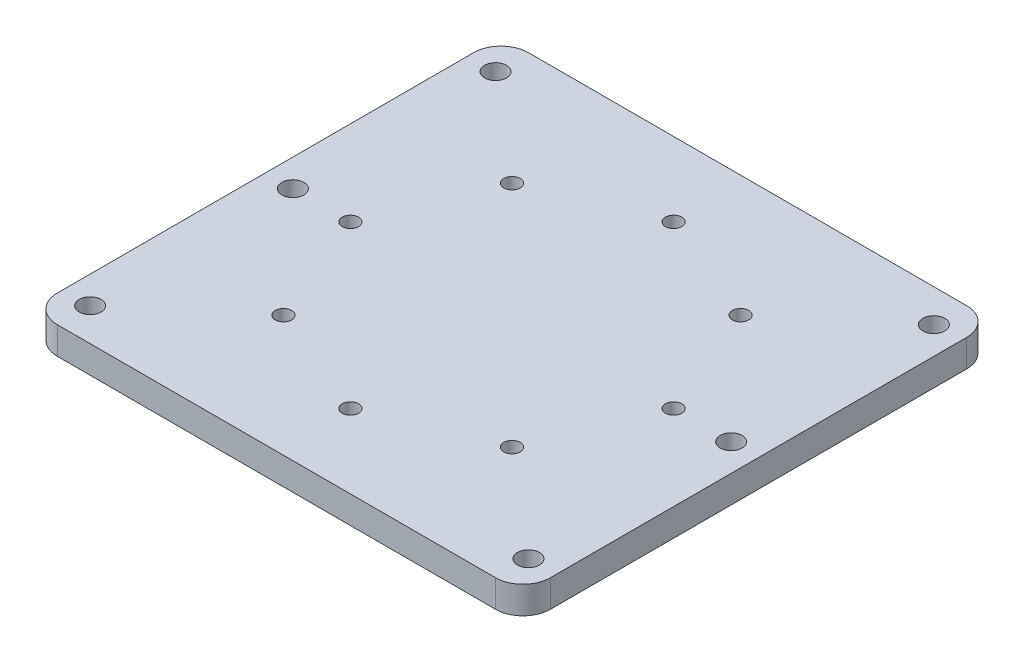
ISO-10303-21;
HEADER;
FILE_DESCRIPTION(('STEP AP214'),'2;1');
FILE_NAME('part.step','',(''),(''),'','','');
FILE_SCHEMA(('AUTOMOTIVE_DESIGN { 1 0 10303 214 1 1 1 1 }'));
ENDSEC;
DATA;
#1=APPLICATION_CONTEXT('core data for automotive mechanical design processes');
#2=APPLICATION_PROTOCOL_DEFINITION('international standard','automotive_design',2000,#1);
#3=PRODUCT_CONTEXT('',#1,'mechanical');
#4=PRODUCT('Part','Part','',(#3));
#5=PRODUCT_RELATED_PRODUCT_CATEGORY('part','',(#4));
#6=PRODUCT_DEFINITION_FORMATION('','',#4);
#7=PRODUCT_DEFINITION_CONTEXT('part definition',#1,'design');
#8=PRODUCT_DEFINITION('design','',#6,#7);
#9=PRODUCT_DEFINITION_SHAPE('','',#8);
#10=(LENGTH_UNIT() NAMED_UNIT(*) SI_UNIT(.MILLI.,.METRE.));
#11=(NAMED_UNIT(*) PLANE_ANGLE_UNIT() SI_UNIT($,.RADIAN.));
#12=(NAMED_UNIT(*) SI_UNIT($,.STERADIAN.) SOLID_ANGLE_UNIT());
#13=UNCERTAINTY_MEASURE_WITH_UNIT(LENGTH_MEASURE(1.E-05),#10,'distance_accuracy_value','');
#14=(GEOMETRIC_REPRESENTATION_CONTEXT(3) GLOBAL_UNCERTAINTY_ASSIGNED_CONTEXT((#13)) GLOBAL_UNIT_ASSIGNED_CONTEXT((#10,
#11,#12)) REPRESENTATION_CONTEXT('',''));
#15=CARTESIAN_POINT('',(0.,0.,0.));
#16=DIRECTION('',(0.,0.,1.));
#17=DIRECTION('',(1.,0.,0.));
#18=AXIS2_PLACEMENT_3D('',#15,#16,#17);
#19=CARTESIAN_POINT('',(0.,5.,0.));
#20=DIRECTION('',(0.,1.,0.));
#21=DIRECTION('',(0.,0.,1.));
#22=AXIS2_PLACEMENT_3D('',#19,#20,#21);
#23=PLANE('',#22);
#24=CARTESIAN_POINT('',(40.,5.,37.));
#25=DIRECTION('',(0.,1.,0.));
#26=DIRECTION('',(0.,0.,1.));
#27=AXIS2_PLACEMENT_3D('',#24,#25,#26);
#28=CIRCLE('',#27,2.);
#29=CARTESIAN_POINT('',(40.,5.,39.));
#30=VERTEX_POINT('',#29);
#31=EDGE_CURVE('E299',#30,#30,#28,.T.);
#32=ORIENTED_EDGE('',*,*,#31,.F.);
#33=EDGE_LOOP('',(#32));
#34=FACE_BOUND('',#33,.T.);
#35=CARTESIAN_POINT('',(-40.,5.,-37.));
#36=DIRECTION('',(0.,1.,0.));
#37=DIRECTION('',(0.,0.,1.));
#38=AXIS2_PLACEMENT_3D('',#35,#36,#37);
#39=CIRCLE('',#38,2.);
#40=CARTESIAN_POINT('',(-40.,5.,-35.));
#41=VERTEX_POINT('',#40);
#42=EDGE_CURVE('E283',#41,#41,#39,.T.);
#43=ORIENTED_EDGE('',*,*,#42,.F.);
#44=EDGE_LOOP('',(#43));
#45=FACE_BOUND('',#44,.T.);
#46=CARTESIAN_POINT('',(-20.8596500450027,5.,-20.859650045002));
#47=DIRECTION('',(0.,1.,0.));
#48=DIRECTION('',(0.,0.,1.));
#49=AXIS2_PLACEMENT_3D('',#46,#47,#48);
#50=CIRCLE('',#49,1.50000000000116);
#51=CARTESIAN_POINT('',(-20.8596500450027,5.,-19.3596500450008));
#52=VERTEX_POINT('',#51);
#53=EDGE_CURVE('E267',#52,#52,#50,.T.);
#54=ORIENTED_EDGE('',*,*,#53,.F.);
#55=EDGE_LOOP('',(#54));
#56=FACE_BOUND('',#55,.T.);
#57=CARTESIAN_POINT('',(-20.8596500450003,5.,20.8596500450043));
#58=DIRECTION('',(0.,1.,0.));
#59=DIRECTION('',(0.,0.,1.));
#60=AXIS2_PLACEMENT_3D('',#57,#58,#59);
#61=CIRCLE('',#60,1.50000000000332);
#62=CARTESIAN_POINT('',(-20.8596500450003,5.,22.3596500450077));
#63=VERTEX_POINT('',#62);
#64=EDGE_CURVE('E251',#63,#63,#61,.T.);
#65=ORIENTED_EDGE('',*,*,#64,.F.);
#66=EDGE_LOOP('',(#65));
#67=FACE_BOUND('',#66,.T.);
#68=CARTESIAN_POINT('',(20.859650045006,5.,20.859650045002));
#69=DIRECTION('',(0.,1.,0.));
#70=DIRECTION('',(0.,0.,1.));
#71=AXIS2_PLACEMENT_3D('',#68,#69,#70);
#72=CIRCLE('',#71,1.50000000000254);
#73=CARTESIAN_POINT('',(20.859650045006,5.,22.3596500450045));
#74=VERTEX_POINT('',#73);
#75=EDGE_CURVE('E235',#74,#74,#72,.T.);
#76=ORIENTED_EDGE('',*,*,#75,.F.);
#77=EDGE_LOOP('',(#76));
#78=FACE_BOUND('',#77,.T.);
#79=CARTESIAN_POINT('',(20.8596500450036,5.,-20.8596500450043));
#80=DIRECTION('',(0.,1.,0.));
#81=DIRECTION('',(0.,0.,1.));
#82=AXIS2_PLACEMENT_3D('',#79,#80,#81);
#83=CIRCLE('',#82,1.50000000000017);
#84=CARTESIAN_POINT('',(20.8596500450036,5.,-19.3596500450042));
#85=VERTEX_POINT('',#84);
#86=EDGE_CURVE('E219',#85,#85,#83,.T.);
#87=ORIENTED_EDGE('',*,*,#86,.F.);
#88=EDGE_LOOP('',(#87));
#89=FACE_BOUND('',#88,.T.);
#90=CARTESIAN_POINT('',(0.,5.,-29.5));
#91=DIRECTION('',(0.,1.,0.));
#92=DIRECTION('',(0.,0.,1.));
#93=AXIS2_PLACEMENT_3D('',#90,#91,#92);
#94=CIRCLE('',#93,1.5);
#95=CARTESIAN_POINT('',(0.,5.,-28.));
#96=VERTEX_POINT('',#95);
#97=EDGE_CURVE('E137',#96,#96,#94,.T.);
#98=ORIENTED_EDGE('',*,*,#97,.F.);
#99=EDGE_LOOP('',(#98));
#100=FACE_BOUND('',#99,.T.);
#101=DIRECTION('',(-1.,0.,0.));
#102=VECTOR('',#101,1.);
#103=CARTESIAN_POINT('',(-45.,5.,-43.));
#104=LINE('',#103,#102);
#105=CARTESIAN_POINT('',(40.,5.,-43.));
#106=VERTEX_POINT('',#105);
#107=CARTESIAN_POINT('',(-40.,5.,-43.));
#108=VERTEX_POINT('',#107);
#109=EDGE_CURVE('E148',#106,#108,#104,.T.);
#110=ORIENTED_EDGE('',*,*,#109,.T.);
#111=CARTESIAN_POINT('',(-40.,5.,-38.));
#112=DIRECTION('',(0.,1.,0.));
#113=DIRECTION('',(0.,0.,1.));
#114=AXIS2_PLACEMENT_3D('',#111,#112,#113);
#115=CIRCLE('',#114,5.);
#116=CARTESIAN_POINT('',(-45.,5.,-38.));
#117=VERTEX_POINT('',#116);
#118=EDGE_CURVE('E178',#108,#117,#115,.T.);
#119=ORIENTED_EDGE('',*,*,#118,.T.);
#120=DIRECTION('',(0.,0.,1.));
#121=VECTOR('',#120,1.);
#122=CARTESIAN_POINT('',(-45.,5.,-43.));
#123=LINE('',#122,#121);
#124=CARTESIAN_POINT('',(-45.,5.,38.));
#125=VERTEX_POINT('',#124);
#126=EDGE_CURVE('E127',#117,#125,#123,.T.);
#127=ORIENTED_EDGE('',*,*,#126,.T.);
#128=CARTESIAN_POINT('',(-40.,5.,38.));
#129=DIRECTION('',(0.,1.,0.));
#130=DIRECTION('',(0.,0.,1.));
#131=AXIS2_PLACEMENT_3D('',#128,#129,#130);
#132=CIRCLE('',#131,5.);
#133=CARTESIAN_POINT('',(-40.,5.,43.));
#134=VERTEX_POINT('',#133);
#135=EDGE_CURVE('E170',#125,#134,#132,.T.);
#136=ORIENTED_EDGE('',*,*,#135,.T.);
#137=DIRECTION('',(1.,0.,0.));
#138=VECTOR('',#137,1.);
#139=CARTESIAN_POINT('',(-45.,5.,43.));
#140=LINE('',#139,#138);
#141=CARTESIAN_POINT('',(40.,5.,43.));
#142=VERTEX_POINT('',#141);
#143=EDGE_CURVE('E193',#134,#142,#140,.T.);
#144=ORIENTED_EDGE('',*,*,#143,.T.);
#145=CARTESIAN_POINT('',(40.,5.,38.));
#146=DIRECTION('',(0.,1.,0.));
#147=DIRECTION('',(0.,0.,1.));
#148=AXIS2_PLACEMENT_3D('',#145,#146,#147);
#149=CIRCLE('',#148,5.);
#150=CARTESIAN_POINT('',(45.,5.,38.));
#151=VERTEX_POINT('',#150);
#152=EDGE_CURVE('E62',#142,#151,#149,.T.);
#153=ORIENTED_EDGE('',*,*,#152,.T.);
#154=DIRECTION('',(0.,0.,-1.));
#155=VECTOR('',#154,1.);
#156=CARTESIAN_POINT('',(45.,5.,-43.));
#157=LINE('',#156,#155);
#158=CARTESIAN_POINT('',(45.,5.,-38.));
#159=VERTEX_POINT('',#158);
#160=EDGE_CURVE('E201',#151,#159,#157,.T.);
#161=ORIENTED_EDGE('',*,*,#160,.T.);
#162=CARTESIAN_POINT('',(40.,5.,-38.));
#163=DIRECTION('',(0.,1.,0.));
#164=DIRECTION('',(0.,0.,1.));
#165=AXIS2_PLACEMENT_3D('',#162,#163,#164);
#166=CIRCLE('',#165,5.);
#167=EDGE_CURVE('E175',#159,#106,#166,.T.);
#168=ORIENTED_EDGE('',*,*,#167,.T.);
#169=EDGE_LOOP('',(#110,#119,#127,#136,#144,#153,#161,#168));
#170=FACE_BOUND('',#169,.T.);
#171=CARTESIAN_POINT('',(-40.,5.,1.6868467896451E-12));
#172=DIRECTION('',(0.,1.,0.));
#173=DIRECTION('',(0.,0.,1.));
#174=AXIS2_PLACEMENT_3D('',#171,#172,#173);
#175=CIRCLE('',#174,2.);
#176=CARTESIAN_POINT('',(-40.,5.,2.00000000000169));
#177=VERTEX_POINT('',#176);
#178=EDGE_CURVE('E213',#177,#177,#175,.T.);
#179=ORIENTED_EDGE('',*,*,#178,.F.);
#180=EDGE_LOOP('',(#179));
#181=FACE_BOUND('',#180,.T.);
#182=CARTESIAN_POINT('',(29.5000000000017,5.,-1.67326814833635E-12));
#183=DIRECTION('',(0.,1.,0.));
#184=DIRECTION('',(0.,0.,1.));
#185=AXIS2_PLACEMENT_3D('',#182,#183,#184);
#186=CIRCLE('',#185,1.50000000000121);
#187=CARTESIAN_POINT('',(29.5000000000017,5.,1.49999999999954));
#188=VERTEX_POINT('',#187);
#189=EDGE_CURVE('E227',#188,#188,#186,.T.);
#190=ORIENTED_EDGE('',*,*,#189,.F.);
#191=EDGE_LOOP('',(#190));
#192=FACE_BOUND('',#191,.T.);
#193=CARTESIAN_POINT('',(3.3465362966727E-12,5.,29.5));
#194=DIRECTION('',(0.,1.,0.));
#195=DIRECTION('',(0.,0.,1.));
#196=AXIS2_PLACEMENT_3D('',#193,#194,#195);
#197=CIRCLE('',#196,1.5000000000034);
#198=CARTESIAN_POINT('',(3.3465362966727E-12,5.,31.0000000000034));
#199=VERTEX_POINT('',#198);
#200=EDGE_CURVE('E243',#199,#199,#197,.T.);
#201=ORIENTED_EDGE('',*,*,#200,.F.);
#202=EDGE_LOOP('',(#201));
#203=FACE_BOUND('',#202,.T.);
#204=CARTESIAN_POINT('',(-29.4999999999983,5.,1.67688085639384E-12));
#205=DIRECTION('',(0.,1.,0.));
#206=DIRECTION('',(0.,0.,1.));
#207=AXIS2_PLACEMENT_3D('',#204,#205,#206);
#208=CIRCLE('',#207,1.50000000000239);
#209=CARTESIAN_POINT('',(-29.4999999999983,5.,1.50000000000407));
#210=VERTEX_POINT('',#209);
#211=EDGE_CURVE('E259',#210,#210,#208,.T.);
#212=ORIENTED_EDGE('',*,*,#211,.F.);
#213=EDGE_LOOP('',(#212));
#214=FACE_BOUND('',#213,.T.);
#215=CARTESIAN_POINT('',(40.,5.,1.67296900183729E-12));
#216=DIRECTION('',(0.,1.,0.));
#217=DIRECTION('',(0.,0.,-1.));
#218=AXIS2_PLACEMENT_3D('',#215,#216,#217);
#219=CIRCLE('',#218,2.);
#220=CARTESIAN_POINT('',(40.,5.,-1.99999999999833));
#221=VERTEX_POINT('',#220);
#222=EDGE_CURVE('E275',#221,#221,#219,.T.);
#223=ORIENTED_EDGE('',*,*,#222,.F.);
#224=EDGE_LOOP('',(#223));
#225=FACE_BOUND('',#224,.T.);
#226=CARTESIAN_POINT('',(40.,5.,-37.));
#227=DIRECTION('',(0.,1.,0.));
#228=DIRECTION('',(0.,0.,-1.));
#229=AXIS2_PLACEMENT_3D('',#226,#227,#228);
#230=CIRCLE('',#229,2.);
#231=CARTESIAN_POINT('',(40.,5.,-39.));
#232=VERTEX_POINT('',#231);
#233=EDGE_CURVE('E291',#232,#232,#230,.T.);
#234=ORIENTED_EDGE('',*,*,#233,.F.);
#235=EDGE_LOOP('',(#234));
#236=FACE_BOUND('',#235,.T.);
#237=CARTESIAN_POINT('',(-40.,5.,37.));
#238=DIRECTION('',(0.,1.,0.));
#239=DIRECTION('',(0.,0.,-1.));
#240=AXIS2_PLACEMENT_3D('',#237,#238,#239);
#241=CIRCLE('',#240,2.);
#242=CARTESIAN_POINT('',(-40.,5.,35.));
#243=VERTEX_POINT('',#242);
#244=EDGE_CURVE('E307',#243,#243,#241,.T.);
#245=ORIENTED_EDGE('',*,*,#244,.F.);
#246=EDGE_LOOP('',(#245));
#247=FACE_BOUND('',#246,.T.);
#248=ADVANCED_FACE('F39',(#34,#45,#56,#67,#78,#89,#100,#170,#181,#192,#203,#214,#225,#236,#247),
#23,.T.);
#249=CARTESIAN_POINT('',(0.,0.,0.));
#250=DIRECTION('',(0.,1.,0.));
#251=DIRECTION('',(0.,0.,1.));
#252=AXIS2_PLACEMENT_3D('',#249,#250,#251);
#253=PLANE('',#252);
#254=DIRECTION('',(0.,0.,1.));
#255=VECTOR('',#254,1.);
#256=CARTESIAN_POINT('',(-45.,0.,-43.));
#257=LINE('',#256,#255);
#258=CARTESIAN_POINT('',(-45.,0.,-38.));
#259=VERTEX_POINT('',#258);
#260=CARTESIAN_POINT('',(-45.,0.,38.));
#261=VERTEX_POINT('',#260);
#262=EDGE_CURVE('E124',#259,#261,#257,.T.);
#263=ORIENTED_EDGE('',*,*,#262,.F.);
#264=CARTESIAN_POINT('',(-40.,0.,-38.));
#265=DIRECTION('',(0.,1.,0.));
#266=DIRECTION('',(0.,0.,1.));
#267=AXIS2_PLACEMENT_3D('',#264,#265,#266);
#268=CIRCLE('',#267,5.);
#269=CARTESIAN_POINT('',(-40.,0.,-43.));
#270=VERTEX_POINT('',#269);
#271=EDGE_CURVE('E106',#259,#270,#268,.F.);
#272=ORIENTED_EDGE('',*,*,#271,.T.);
#273=DIRECTION('',(-1.,0.,0.));
#274=VECTOR('',#273,1.);
#275=CARTESIAN_POINT('',(-45.,0.,-43.));
#276=LINE('',#275,#274);
#277=CARTESIAN_POINT('',(40.,0.,-43.));
#278=VERTEX_POINT('',#277);
#279=EDGE_CURVE('E153',#278,#270,#276,.T.);
#280=ORIENTED_EDGE('',*,*,#279,.F.);
#281=CARTESIAN_POINT('',(40.,0.,-38.));
#282=DIRECTION('',(0.,1.,0.));
#283=DIRECTION('',(0.,0.,1.));
#284=AXIS2_PLACEMENT_3D('',#281,#282,#283);
#285=CIRCLE('',#284,5.);
#286=CARTESIAN_POINT('',(45.,0.,-38.));
#287=VERTEX_POINT('',#286);
#288=EDGE_CURVE('E118',#278,#287,#285,.F.);
#289=ORIENTED_EDGE('',*,*,#288,.T.);
#290=DIRECTION('',(0.,0.,-1.));
#291=VECTOR('',#290,1.);
#292=CARTESIAN_POINT('',(45.,0.,-43.));
#293=LINE('',#292,#291);
#294=CARTESIAN_POINT('',(45.,0.,38.));
#295=VERTEX_POINT('',#294);
#296=EDGE_CURVE('E142',#295,#287,#293,.T.);
#297=ORIENTED_EDGE('',*,*,#296,.F.);
#298=CARTESIAN_POINT('',(40.,0.,38.));
#299=DIRECTION('',(0.,1.,0.));
#300=DIRECTION('',(0.,0.,1.));
#301=AXIS2_PLACEMENT_3D('',#298,#299,#300);
#302=CIRCLE('',#301,5.);
#303=CARTESIAN_POINT('',(40.,0.,43.));
#304=VERTEX_POINT('',#303);
#305=EDGE_CURVE('E160',#295,#304,#302,.F.);
#306=ORIENTED_EDGE('',*,*,#305,.T.);
#307=DIRECTION('',(1.,0.,0.));
#308=VECTOR('',#307,1.);
#309=CARTESIAN_POINT('',(-45.,0.,43.));
#310=LINE('',#309,#308);
#311=CARTESIAN_POINT('',(-40.,0.,43.));
#312=VERTEX_POINT('',#311);
#313=EDGE_CURVE('E136',#312,#304,#310,.T.);
#314=ORIENTED_EDGE('',*,*,#313,.F.);
#315=CARTESIAN_POINT('',(-40.,0.,38.));
#316=DIRECTION('',(0.,1.,0.));
#317=DIRECTION('',(0.,0.,1.));
#318=AXIS2_PLACEMENT_3D('',#315,#316,#317);
#319=CIRCLE('',#318,5.);
#320=EDGE_CURVE('E129',#312,#261,#319,.F.);
#321=ORIENTED_EDGE('',*,*,#320,.T.);
#322=EDGE_LOOP('',(#263,#272,#280,#289,#297,#306,#314,#321));
#323=FACE_BOUND('',#322,.T.);
#324=CARTESIAN_POINT('',(0.,0.,-29.5));
#325=DIRECTION('',(0.,1.,0.));
#326=DIRECTION('',(0.,0.,1.));
#327=AXIS2_PLACEMENT_3D('',#324,#325,#326);
#328=CIRCLE('',#327,1.5);
#329=CARTESIAN_POINT('',(0.,0.,-28.));
#330=VERTEX_POINT('',#329);
#331=EDGE_CURVE('E145',#330,#330,#328,.T.);
#332=ORIENTED_EDGE('',*,*,#331,.T.);
#333=EDGE_LOOP('',(#332));
#334=FACE_BOUND('',#333,.T.);
#335=CARTESIAN_POINT('',(-40.,0.,1.6868467896451E-12));
#336=DIRECTION('',(0.,1.,0.));
#337=DIRECTION('',(0.,0.,1.));
#338=AXIS2_PLACEMENT_3D('',#335,#336,#337);
#339=CIRCLE('',#338,2.);
#340=CARTESIAN_POINT('',(-40.,0.,2.00000000000169));
#341=VERTEX_POINT('',#340);
#342=EDGE_CURVE('E215',#341,#341,#339,.T.);
#343=ORIENTED_EDGE('',*,*,#342,.T.);
#344=EDGE_LOOP('',(#343));
#345=FACE_BOUND('',#344,.T.);
#346=CARTESIAN_POINT('',(20.8596500450036,0.,-20.8596500450043));
#347=DIRECTION('',(0.,1.,0.));
#348=DIRECTION('',(0.,0.,1.));
#349=AXIS2_PLACEMENT_3D('',#346,#347,#348);
#350=CIRCLE('',#349,1.50000000000017);
#351=CARTESIAN_POINT('',(20.8596500450036,0.,-19.3596500450042));
#352=VERTEX_POINT('',#351);
#353=EDGE_CURVE('E223',#352,#352,#350,.T.);
#354=ORIENTED_EDGE('',*,*,#353,.T.);
#355=EDGE_LOOP('',(#354));
#356=FACE_BOUND('',#355,.T.);
#357=CARTESIAN_POINT('',(29.5000000000017,0.,-1.67326814833635E-12));
#358=DIRECTION('',(0.,1.,0.));
#359=DIRECTION('',(0.,0.,1.));
#360=AXIS2_PLACEMENT_3D('',#357,#358,#359);
#361=CIRCLE('',#360,1.50000000000121);
#362=CARTESIAN_POINT('',(29.5000000000017,0.,1.49999999999954));
#363=VERTEX_POINT('',#362);
#364=EDGE_CURVE('E231',#363,#363,#361,.T.);
#365=ORIENTED_EDGE('',*,*,#364,.T.);
#366=EDGE_LOOP('',(#365));
#367=FACE_BOUND('',#366,.T.);
#368=CARTESIAN_POINT('',(20.859650045006,0.,20.859650045002));
#369=DIRECTION('',(0.,1.,0.));
#370=DIRECTION('',(0.,0.,1.));
#371=AXIS2_PLACEMENT_3D('',#368,#369,#370);
#372=CIRCLE('',#371,1.50000000000254);
#373=CARTESIAN_POINT('',(20.859650045006,0.,22.3596500450045));
#374=VERTEX_POINT('',#373);
#375=EDGE_CURVE('E239',#374,#374,#372,.T.);
#376=ORIENTED_EDGE('',*,*,#375,.T.);
#377=EDGE_LOOP('',(#376));
#378=FACE_BOUND('',#377,.T.);
#379=CARTESIAN_POINT('',(3.3465362966727E-12,0.,29.5));
#380=DIRECTION('',(0.,1.,0.));
#381=DIRECTION('',(0.,0.,1.));
#382=AXIS2_PLACEMENT_3D('',#379,#380,#381);
#383=CIRCLE('',#382,1.5000000000034);
#384=CARTESIAN_POINT('',(3.3465362966727E-12,0.,31.0000000000034));
#385=VERTEX_POINT('',#384);
#386=EDGE_CURVE('E247',#385,#385,#383,.T.);
#387=ORIENTED_EDGE('',*,*,#386,.T.);
#388=EDGE_LOOP('',(#387));
#389=FACE_BOUND('',#388,.T.);
#390=CARTESIAN_POINT('',(-20.8596500450003,0.,20.8596500450043));
#391=DIRECTION('',(0.,1.,0.));
#392=DIRECTION('',(0.,0.,1.));
#393=AXIS2_PLACEMENT_3D('',#390,#391,#392);
#394=CIRCLE('',#393,1.50000000000332);
#395=CARTESIAN_POINT('',(-20.8596500450003,0.,22.3596500450077));
#396=VERTEX_POINT('',#395);
#397=EDGE_CURVE('E255',#396,#396,#394,.T.);
#398=ORIENTED_EDGE('',*,*,#397,.T.);
#399=EDGE_LOOP('',(#398));
#400=FACE_BOUND('',#399,.T.);
#401=CARTESIAN_POINT('',(-29.4999999999983,0.,1.67688085639384E-12));
#402=DIRECTION('',(0.,1.,0.));
#403=DIRECTION('',(0.,0.,1.));
#404=AXIS2_PLACEMENT_3D('',#401,#402,#403);
#405=CIRCLE('',#404,1.50000000000239);
#406=CARTESIAN_POINT('',(-29.4999999999983,0.,1.50000000000407));
#407=VERTEX_POINT('',#406);
#408=EDGE_CURVE('E263',#407,#407,#405,.T.);
#409=ORIENTED_EDGE('',*,*,#408,.T.);
#410=EDGE_LOOP('',(#409));
#411=FACE_BOUND('',#410,.T.);
#412=CARTESIAN_POINT('',(-20.8596500450027,0.,-20.859650045002));
#413=DIRECTION('',(0.,1.,0.));
#414=DIRECTION('',(0.,0.,1.));
#415=AXIS2_PLACEMENT_3D('',#412,#413,#414);
#416=CIRCLE('',#415,1.50000000000116);
#417=CARTESIAN_POINT('',(-20.8596500450027,0.,-19.3596500450008));
#418=VERTEX_POINT('',#417);
#419=EDGE_CURVE('E271',#418,#418,#416,.T.);
#420=ORIENTED_EDGE('',*,*,#419,.T.);
#421=EDGE_LOOP('',(#420));
#422=FACE_BOUND('',#421,.T.);
#423=CARTESIAN_POINT('',(40.,0.,1.67296900183729E-12));
#424=DIRECTION('',(0.,1.,0.));
#425=DIRECTION('',(0.,0.,-1.));
#426=AXIS2_PLACEMENT_3D('',#423,#424,#425);
#427=CIRCLE('',#426,2.);
#428=CARTESIAN_POINT('',(40.,0.,-1.99999999999833));
#429=VERTEX_POINT('',#428);
#430=EDGE_CURVE('E279',#429,#429,#427,.T.);
#431=ORIENTED_EDGE('',*,*,#430,.T.);
#432=EDGE_LOOP('',(#431));
#433=FACE_BOUND('',#432,.T.);
#434=CARTESIAN_POINT('',(-40.,0.,-37.));
#435=DIRECTION('',(0.,1.,0.));
#436=DIRECTION('',(0.,0.,1.));
#437=AXIS2_PLACEMENT_3D('',#434,#435,#436);
#438=CIRCLE('',#437,2.);
#439=CARTESIAN_POINT('',(-40.,0.,-35.));
#440=VERTEX_POINT('',#439);
#441=EDGE_CURVE('E287',#440,#440,#438,.T.);
#442=ORIENTED_EDGE('',*,*,#441,.T.);
#443=EDGE_LOOP('',(#442));
#444=FACE_BOUND('',#443,.T.);
#445=CARTESIAN_POINT('',(40.,0.,-37.));
#446=DIRECTION('',(0.,1.,0.));
#447=DIRECTION('',(0.,0.,-1.));
#448=AXIS2_PLACEMENT_3D('',#445,#446,#447);
#449=CIRCLE('',#448,2.);
#450=CARTESIAN_POINT('',(40.,0.,-39.));
#451=VERTEX_POINT('',#450);
#452=EDGE_CURVE('E295',#451,#451,#449,.T.);
#453=ORIENTED_EDGE('',*,*,#452,.T.);
#454=EDGE_LOOP('',(#453));
#455=FACE_BOUND('',#454,.T.);
#456=CARTESIAN_POINT('',(40.,0.,37.));
#457=DIRECTION('',(0.,1.,0.));
#458=DIRECTION('',(0.,0.,1.));
#459=AXIS2_PLACEMENT_3D('',#456,#457,#458);
#460=CIRCLE('',#459,2.);
#461=CARTESIAN_POINT('',(40.,0.,39.));
#462=VERTEX_POINT('',#461);
#463=EDGE_CURVE('E303',#462,#462,#460,.T.);
#464=ORIENTED_EDGE('',*,*,#463,.T.);
#465=EDGE_LOOP('',(#464));
#466=FACE_BOUND('',#465,.T.);
#467=CARTESIAN_POINT('',(-40.,0.,37.));
#468=DIRECTION('',(0.,1.,0.));
#469=DIRECTION('',(0.,0.,-1.));
#470=AXIS2_PLACEMENT_3D('',#467,#468,#469);
#471=CIRCLE('',#470,2.);
#472=CARTESIAN_POINT('',(-40.,0.,35.));
#473=VERTEX_POINT('',#472);
#474=EDGE_CURVE('E311',#473,#473,#471,.T.);
#475=ORIENTED_EDGE('',*,*,#474,.T.);
#476=EDGE_LOOP('',(#475));
#477=FACE_BOUND('',#476,.T.);
#478=ADVANCED_FACE('F132',(#323,#334,#345,#356,#367,#378,#389,#400,#411,#422,#433,#444,#455,
#466,#477),#253,.F.);
#479=CARTESIAN_POINT('',(-45.,5.,-43.));
#480=DIRECTION('',(1.,0.,0.));
#481=DIRECTION('',(0.,0.,-1.));
#482=AXIS2_PLACEMENT_3D('',#479,#480,#481);
#483=PLANE('',#482);
#484=ORIENTED_EDGE('',*,*,#126,.F.);
#485=DIRECTION('',(0.,-1.,0.));
#486=VECTOR('',#485,1.);
#487=CARTESIAN_POINT('',(-45.,5.,-38.));
#488=LINE('',#487,#486);
#489=EDGE_CURVE('E110',#117,#259,#488,.T.);
#490=ORIENTED_EDGE('',*,*,#489,.T.);
#491=ORIENTED_EDGE('',*,*,#262,.T.);
#492=DIRECTION('',(0.,-1.,0.));
#493=VECTOR('',#492,1.);
#494=CARTESIAN_POINT('',(-45.,5.,38.));
#495=LINE('',#494,#493);
#496=EDGE_CURVE('E130',#261,#125,#495,.F.);
#497=ORIENTED_EDGE('',*,*,#496,.T.);
#498=EDGE_LOOP('',(#484,#490,#491,#497));
#499=FACE_BOUND('',#498,.T.);
#500=ADVANCED_FACE('F123',(#499),#483,.F.);
#501=CARTESIAN_POINT('',(-45.,5.,43.));
#502=DIRECTION('',(0.,0.,-1.));
#503=DIRECTION('',(-1.,0.,0.));
#504=AXIS2_PLACEMENT_3D('',#501,#502,#503);
#505=PLANE('',#504);
#506=ORIENTED_EDGE('',*,*,#313,.T.);
#507=DIRECTION('',(0.,-1.,0.));
#508=VECTOR('',#507,1.);
#509=CARTESIAN_POINT('',(40.,5.,43.));
#510=LINE('',#509,#508);
#511=EDGE_CURVE('E11',#304,#142,#510,.F.);
#512=ORIENTED_EDGE('',*,*,#511,.T.);
#513=ORIENTED_EDGE('',*,*,#143,.F.);
#514=DIRECTION('',(0.,-1.,0.));
#515=VECTOR('',#514,1.);
#516=CARTESIAN_POINT('',(-40.,5.,43.));
#517=LINE('',#516,#515);
#518=EDGE_CURVE('E48',#134,#312,#517,.T.);
#519=ORIENTED_EDGE('',*,*,#518,.T.);
#520=EDGE_LOOP('',(#506,#512,#513,#519));
#521=FACE_BOUND('',#520,.T.);
#522=ADVANCED_FACE('F191',(#521),#505,.F.);
#523=CARTESIAN_POINT('',(45.,5.,-43.));
#524=DIRECTION('',(-1.,0.,0.));
#525=DIRECTION('',(0.,0.,1.));
#526=AXIS2_PLACEMENT_3D('',#523,#524,#525);
#527=PLANE('',#526);
#528=ORIENTED_EDGE('',*,*,#296,.T.);
#529=DIRECTION('',(0.,-1.,0.));
#530=VECTOR('',#529,1.);
#531=CARTESIAN_POINT('',(45.,5.,-38.));
#532=LINE('',#531,#530);
#533=EDGE_CURVE('E55',#287,#159,#532,.F.);
#534=ORIENTED_EDGE('',*,*,#533,.T.);
#535=ORIENTED_EDGE('',*,*,#160,.F.);
#536=DIRECTION('',(0.,-1.,0.));
#537=VECTOR('',#536,1.);
#538=CARTESIAN_POINT('',(45.,5.,38.));
#539=LINE('',#538,#537);
#540=EDGE_CURVE('E181',#151,#295,#539,.T.);
#541=ORIENTED_EDGE('',*,*,#540,.T.);
#542=EDGE_LOOP('',(#528,#534,#535,#541));
#543=FACE_BOUND('',#542,.T.);
#544=ADVANCED_FACE('F200',(#543),#527,.F.);
#545=CARTESIAN_POINT('',(-45.,5.,-43.));
#546=DIRECTION('',(0.,0.,1.));
#547=DIRECTION('',(1.,0.,0.));
#548=AXIS2_PLACEMENT_3D('',#545,#546,#547);
#549=PLANE('',#548);
#550=ORIENTED_EDGE('',*,*,#279,.T.);
#551=DIRECTION('',(0.,-1.,0.));
#552=VECTOR('',#551,1.);
#553=CARTESIAN_POINT('',(-40.,5.,-43.));
#554=LINE('',#553,#552);
#555=EDGE_CURVE('E111',#270,#108,#554,.F.);
#556=ORIENTED_EDGE('',*,*,#555,.T.);
#557=ORIENTED_EDGE('',*,*,#109,.F.);
#558=DIRECTION('',(0.,-1.,0.));
#559=VECTOR('',#558,1.);
#560=CARTESIAN_POINT('',(40.,5.,-43.));
#561=LINE('',#560,#559);
#562=EDGE_CURVE('E117',#106,#278,#561,.T.);
#563=ORIENTED_EDGE('',*,*,#562,.T.);
#564=EDGE_LOOP('',(#550,#556,#557,#563));
#565=FACE_BOUND('',#564,.T.);
#566=ADVANCED_FACE('F335',(#565),#549,.F.);
#567=CARTESIAN_POINT('',(0.,5.,-29.5));
#568=DIRECTION('',(0.,-1.,0.));
#569=DIRECTION('',(0.,0.,-1.));
#570=AXIS2_PLACEMENT_3D('',#567,#568,#569);
#571=CYLINDRICAL_SURFACE('',#570,1.5);
#572=ORIENTED_EDGE('',*,*,#97,.T.);
#573=EDGE_LOOP('',(#572));
#574=FACE_BOUND('',#573,.T.);
#575=ORIENTED_EDGE('',*,*,#331,.F.);
#576=EDGE_LOOP('',(#575));
#577=FACE_BOUND('',#576,.T.);
#578=ADVANCED_FACE('F332',(#574,#577),#571,.F.);
#579=CARTESIAN_POINT('',(-40.,5.,1.6868467896451E-12));
#580=DIRECTION('',(0.,-1.,0.));
#581=DIRECTION('',(0.,0.,-1.));
#582=AXIS2_PLACEMENT_3D('',#579,#580,#581);
#583=CYLINDRICAL_SURFACE('',#582,2.);
#584=ORIENTED_EDGE('',*,*,#178,.T.);
#585=EDGE_LOOP('',(#584));
#586=FACE_BOUND('',#585,.T.);
#587=ORIENTED_EDGE('',*,*,#342,.F.);
#588=EDGE_LOOP('',(#587));
#589=FACE_BOUND('',#588,.T.);
#590=ADVANCED_FACE('F424',(#586,#589),#583,.F.);
#591=CARTESIAN_POINT('',(20.8596500450036,5.,-20.8596500450043));
#592=DIRECTION('',(0.,-1.,0.));
#593=DIRECTION('',(0.,0.,-1.));
#594=AXIS2_PLACEMENT_3D('',#591,#592,#593);
#595=CYLINDRICAL_SURFACE('',#594,1.50000000000017);
#596=ORIENTED_EDGE('',*,*,#86,.T.);
#597=EDGE_LOOP('',(#596));
#598=FACE_BOUND('',#597,.T.);
#599=ORIENTED_EDGE('',*,*,#353,.F.);
#600=EDGE_LOOP('',(#599));
#601=FACE_BOUND('',#600,.T.);
#602=ADVANCED_FACE('F421',(#598,#601),#595,.F.);
#603=CARTESIAN_POINT('',(29.5000000000017,5.,-1.67326814833635E-12));
#604=DIRECTION('',(0.,-1.,0.));
#605=DIRECTION('',(0.,0.,-1.));
#606=AXIS2_PLACEMENT_3D('',#603,#604,#605);
#607=CYLINDRICAL_SURFACE('',#606,1.50000000000121);
#608=ORIENTED_EDGE('',*,*,#189,.T.);
#609=EDGE_LOOP('',(#608));
#610=FACE_BOUND('',#609,.T.);
#611=ORIENTED_EDGE('',*,*,#364,.F.);
#612=EDGE_LOOP('',(#611));
#613=FACE_BOUND('',#612,.T.);
#614=ADVANCED_FACE('F417',(#610,#613),#607,.F.);
#615=CARTESIAN_POINT('',(20.859650045006,5.,20.859650045002));
#616=DIRECTION('',(0.,-1.,0.));
#617=DIRECTION('',(0.,0.,-1.));
#618=AXIS2_PLACEMENT_3D('',#615,#616,#617);
#619=CYLINDRICAL_SURFACE('',#618,1.50000000000254);
#620=ORIENTED_EDGE('',*,*,#75,.T.);
#621=EDGE_LOOP('',(#620));
#622=FACE_BOUND('',#621,.T.);
#623=ORIENTED_EDGE('',*,*,#375,.F.);
#624=EDGE_LOOP('',(#623));
#625=FACE_BOUND('',#624,.T.);
#626=ADVANCED_FACE('F413',(#622,#625),#619,.F.);
#627=CARTESIAN_POINT('',(3.3465362966727E-12,5.,29.5));
#628=DIRECTION('',(0.,-1.,0.));
#629=DIRECTION('',(0.,0.,-1.));
#630=AXIS2_PLACEMENT_3D('',#627,#628,#629);
#631=CYLINDRICAL_SURFACE('',#630,1.5000000000034);
#632=ORIENTED_EDGE('',*,*,#200,.T.);
#633=EDGE_LOOP('',(#632));
#634=FACE_BOUND('',#633,.T.);
#635=ORIENTED_EDGE('',*,*,#386,.F.);
#636=EDGE_LOOP('',(#635));
#637=FACE_BOUND('',#636,.T.);
#638=ADVANCED_FACE('F409',(#634,#637),#631,.F.);
#639=CARTESIAN_POINT('',(-20.8596500450003,5.,20.8596500450043));
#640=DIRECTION('',(0.,-1.,0.));
#641=DIRECTION('',(0.,0.,-1.));
#642=AXIS2_PLACEMENT_3D('',#639,#640,#641);
#643=CYLINDRICAL_SURFACE('',#642,1.50000000000332);
#644=ORIENTED_EDGE('',*,*,#64,.T.);
#645=EDGE_LOOP('',(#644));
#646=FACE_BOUND('',#645,.T.);
#647=ORIENTED_EDGE('',*,*,#397,.F.);
#648=EDGE_LOOP('',(#647));
#649=FACE_BOUND('',#648,.T.);
#650=ADVANCED_FACE('F405',(#646,#649),#643,.F.);
#651=CARTESIAN_POINT('',(-29.4999999999983,5.,1.67688085639384E-12));
#652=DIRECTION('',(0.,-1.,0.));
#653=DIRECTION('',(0.,0.,-1.));
#654=AXIS2_PLACEMENT_3D('',#651,#652,#653);
#655=CYLINDRICAL_SURFACE('',#654,1.50000000000239);
#656=ORIENTED_EDGE('',*,*,#211,.T.);
#657=EDGE_LOOP('',(#656));
#658=FACE_BOUND('',#657,.T.);
#659=ORIENTED_EDGE('',*,*,#408,.F.);
#660=EDGE_LOOP('',(#659));
#661=FACE_BOUND('',#660,.T.);
#662=ADVANCED_FACE('F401',(#658,#661),#655,.F.);
#663=CARTESIAN_POINT('',(-20.8596500450027,5.,-20.859650045002));
#664=DIRECTION('',(0.,-1.,0.));
#665=DIRECTION('',(0.,0.,-1.));
#666=AXIS2_PLACEMENT_3D('',#663,#664,#665);
#667=CYLINDRICAL_SURFACE('',#666,1.50000000000116);
#668=ORIENTED_EDGE('',*,*,#53,.T.);
#669=EDGE_LOOP('',(#668));
#670=FACE_BOUND('',#669,.T.);
#671=ORIENTED_EDGE('',*,*,#419,.F.);
#672=EDGE_LOOP('',(#671));
#673=FACE_BOUND('',#672,.T.);
#674=ADVANCED_FACE('F397',(#670,#673),#667,.F.);
#675=CARTESIAN_POINT('',(40.,5.,1.67296900183729E-12));
#676=DIRECTION('',(0.,-1.,0.));
#677=DIRECTION('',(0.,0.,-1.));
#678=AXIS2_PLACEMENT_3D('',#675,#676,#677);
#679=CYLINDRICAL_SURFACE('',#678,2.);
#680=ORIENTED_EDGE('',*,*,#222,.T.);
#681=EDGE_LOOP('',(#680));
#682=FACE_BOUND('',#681,.T.);
#683=ORIENTED_EDGE('',*,*,#430,.F.);
#684=EDGE_LOOP('',(#683));
#685=FACE_BOUND('',#684,.T.);
#686=ADVANCED_FACE('F393',(#682,#685),#679,.F.);
#687=CARTESIAN_POINT('',(-40.,5.,-37.));
#688=DIRECTION('',(0.,-1.,0.));
#689=DIRECTION('',(0.,0.,-1.));
#690=AXIS2_PLACEMENT_3D('',#687,#688,#689);
#691=CYLINDRICAL_SURFACE('',#690,2.);
#692=ORIENTED_EDGE('',*,*,#42,.T.);
#693=EDGE_LOOP('',(#692));
#694=FACE_BOUND('',#693,.T.);
#695=ORIENTED_EDGE('',*,*,#441,.F.);
#696=EDGE_LOOP('',(#695));
#697=FACE_BOUND('',#696,.T.);
#698=ADVANCED_FACE('F375',(#694,#697),#691,.F.);
#699=CARTESIAN_POINT('',(40.,5.,-37.));
#700=DIRECTION('',(0.,-1.,0.));
#701=DIRECTION('',(0.,0.,-1.));
#702=AXIS2_PLACEMENT_3D('',#699,#700,#701);
#703=CYLINDRICAL_SURFACE('',#702,2.);
#704=ORIENTED_EDGE('',*,*,#233,.T.);
#705=EDGE_LOOP('',(#704));
#706=FACE_BOUND('',#705,.T.);
#707=ORIENTED_EDGE('',*,*,#452,.F.);
#708=EDGE_LOOP('',(#707));
#709=FACE_BOUND('',#708,.T.);
#710=ADVANCED_FACE('F371',(#706,#709),#703,.F.);
#711=CARTESIAN_POINT('',(40.,5.,37.));
#712=DIRECTION('',(0.,-1.,0.));
#713=DIRECTION('',(0.,0.,-1.));
#714=AXIS2_PLACEMENT_3D('',#711,#712,#713);
#715=CYLINDRICAL_SURFACE('',#714,2.);
#716=ORIENTED_EDGE('',*,*,#31,.T.);
#717=EDGE_LOOP('',(#716));
#718=FACE_BOUND('',#717,.T.);
#719=ORIENTED_EDGE('',*,*,#463,.F.);
#720=EDGE_LOOP('',(#719));
#721=FACE_BOUND('',#720,.T.);
#722=ADVANCED_FACE('F374',(#718,#721),#715,.F.);
#723=CARTESIAN_POINT('',(-40.,5.,37.));
#724=DIRECTION('',(0.,-1.,0.));
#725=DIRECTION('',(0.,0.,-1.));
#726=AXIS2_PLACEMENT_3D('',#723,#724,#725);
#727=CYLINDRICAL_SURFACE('',#726,2.);
#728=ORIENTED_EDGE('',*,*,#244,.T.);
#729=EDGE_LOOP('',(#728));
#730=FACE_BOUND('',#729,.T.);
#731=ORIENTED_EDGE('',*,*,#474,.F.);
#732=EDGE_LOOP('',(#731));
#733=FACE_BOUND('',#732,.T.);
#734=ADVANCED_FACE('F319',(#730,#733),#727,.F.);
#735=CARTESIAN_POINT('',(-40.,5.,-38.));
#736=DIRECTION('',(0.,-1.,0.));
#737=DIRECTION('',(0.,0.,-1.));
#738=AXIS2_PLACEMENT_3D('',#735,#736,#737);
#739=CYLINDRICAL_SURFACE('',#738,5.);
#740=ORIENTED_EDGE('',*,*,#118,.F.);
#741=ORIENTED_EDGE('',*,*,#555,.F.);
#742=ORIENTED_EDGE('',*,*,#271,.F.);
#743=ORIENTED_EDGE('',*,*,#489,.F.);
#744=EDGE_LOOP('',(#740,#741,#742,#743));
#745=FACE_BOUND('',#744,.T.);
#746=ADVANCED_FACE('F109',(#745),#739,.T.);
#747=CARTESIAN_POINT('',(40.,5.,-38.));
#748=DIRECTION('',(0.,-1.,0.));
#749=DIRECTION('',(0.,0.,-1.));
#750=AXIS2_PLACEMENT_3D('',#747,#748,#749);
#751=CYLINDRICAL_SURFACE('',#750,5.);
#752=ORIENTED_EDGE('',*,*,#167,.F.);
#753=ORIENTED_EDGE('',*,*,#533,.F.);
#754=ORIENTED_EDGE('',*,*,#288,.F.);
#755=ORIENTED_EDGE('',*,*,#562,.F.);
#756=EDGE_LOOP('',(#752,#753,#754,#755));
#757=FACE_BOUND('',#756,.T.);
#758=ADVANCED_FACE('F347',(#757),#751,.T.);
#759=CARTESIAN_POINT('',(40.,5.,38.));
#760=DIRECTION('',(0.,-1.,0.));
#761=DIRECTION('',(0.,0.,-1.));
#762=AXIS2_PLACEMENT_3D('',#759,#760,#761);
#763=CYLINDRICAL_SURFACE('',#762,5.);
#764=ORIENTED_EDGE('',*,*,#152,.F.);
#765=ORIENTED_EDGE('',*,*,#511,.F.);
#766=ORIENTED_EDGE('',*,*,#305,.F.);
#767=ORIENTED_EDGE('',*,*,#540,.F.);
#768=EDGE_LOOP('',(#764,#765,#766,#767));
#769=FACE_BOUND('',#768,.T.);
#770=ADVANCED_FACE('F199',(#769),#763,.T.);
#771=CARTESIAN_POINT('',(-40.,5.,38.));
#772=DIRECTION('',(0.,-1.,0.));
#773=DIRECTION('',(0.,0.,-1.));
#774=AXIS2_PLACEMENT_3D('',#771,#772,#773);
#775=CYLINDRICAL_SURFACE('',#774,5.);
#776=ORIENTED_EDGE('',*,*,#135,.F.);
#777=ORIENTED_EDGE('',*,*,#496,.F.);
#778=ORIENTED_EDGE('',*,*,#320,.F.);
#779=ORIENTED_EDGE('',*,*,#518,.F.);
#780=EDGE_LOOP('',(#776,#777,#778,#779));
#781=FACE_BOUND('',#780,.T.);
#782=ADVANCED_FACE('F41',(#781),#775,.T.);
#783=CLOSED_SHELL('',(#248,#478,#500,#522,#544,#566,#578,#590,#602,#614,#626,#638,#650,#662,
#674,#686,#698,#710,#722,#734,#746,#758,#770,#782));
#784=MANIFOLD_SOLID_BREP('B2',#783);
#785=ADVANCED_BREP_SHAPE_REPRESENTATION('',(#18,#784),#14);
#786=SHAPE_DEFINITION_REPRESENTATION(#9,#785);
ENDSEC;
END-ISO-10303-21;
